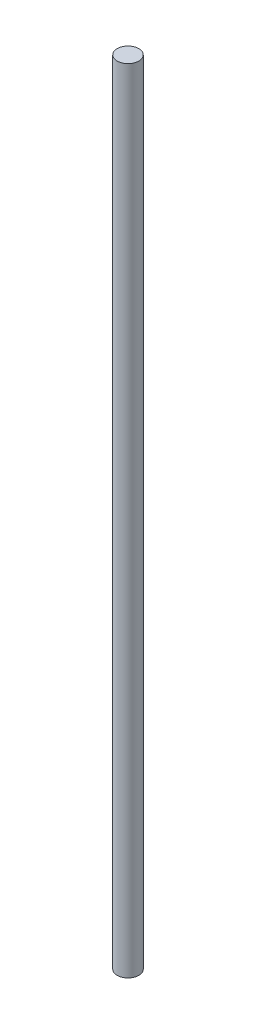
ISO-10303-21;
HEADER;
FILE_DESCRIPTION(('STEP AP214'),'2;1');
FILE_NAME('part.step','',(''),(''),'','','');
FILE_SCHEMA(('AUTOMOTIVE_DESIGN { 1 0 10303 214 1 1 1 1 }'));
ENDSEC;
DATA;
#1=APPLICATION_CONTEXT('core data for automotive mechanical design processes');
#2=APPLICATION_PROTOCOL_DEFINITION('international standard','automotive_design',2000,#1);
#3=PRODUCT_CONTEXT('',#1,'mechanical');
#4=PRODUCT('Part','Part','',(#3));
#5=PRODUCT_RELATED_PRODUCT_CATEGORY('part','',(#4));
#6=PRODUCT_DEFINITION_FORMATION('','',#4);
#7=PRODUCT_DEFINITION_CONTEXT('part definition',#1,'design');
#8=PRODUCT_DEFINITION('design','',#6,#7);
#9=PRODUCT_DEFINITION_SHAPE('','',#8);
#10=(LENGTH_UNIT() NAMED_UNIT(*) SI_UNIT(.MILLI.,.METRE.));
#11=(NAMED_UNIT(*) PLANE_ANGLE_UNIT() SI_UNIT($,.RADIAN.));
#12=(NAMED_UNIT(*) SI_UNIT($,.STERADIAN.) SOLID_ANGLE_UNIT());
#13=UNCERTAINTY_MEASURE_WITH_UNIT(LENGTH_MEASURE(1.E-05),#10,'distance_accuracy_value','');
#14=(GEOMETRIC_REPRESENTATION_CONTEXT(3) GLOBAL_UNCERTAINTY_ASSIGNED_CONTEXT((#13)) GLOBAL_UNIT_ASSIGNED_CONTEXT((#10,
#11,#12)) REPRESENTATION_CONTEXT('',''));
#15=CARTESIAN_POINT('',(0.,0.,0.));
#16=DIRECTION('',(0.,0.,1.));
#17=DIRECTION('',(1.,0.,0.));
#18=AXIS2_PLACEMENT_3D('',#15,#16,#17);
#19=CARTESIAN_POINT('',(0.,110.,0.));
#20=DIRECTION('',(0.,-1.,0.));
#21=DIRECTION('',(0.,0.,-1.));
#22=AXIS2_PLACEMENT_3D('',#19,#20,#21);
#23=CYLINDRICAL_SURFACE('',#22,1.5);
#24=CARTESIAN_POINT('',(0.,110.,0.));
#25=DIRECTION('',(0.,1.,0.));
#26=DIRECTION('',(0.,0.,1.));
#27=AXIS2_PLACEMENT_3D('',#24,#25,#26);
#28=CIRCLE('',#27,1.5);
#29=CARTESIAN_POINT('',(0.,110.,1.5));
#30=VERTEX_POINT('',#29);
#31=EDGE_CURVE('E10',#30,#30,#28,.T.);
#32=ORIENTED_EDGE('',*,*,#31,.F.);
#33=EDGE_LOOP('',(#32));
#34=FACE_BOUND('',#33,.T.);
#35=CARTESIAN_POINT('',(0.,0.,0.));
#36=DIRECTION('',(0.,1.,0.));
#37=DIRECTION('',(0.,0.,1.));
#38=AXIS2_PLACEMENT_3D('',#35,#36,#37);
#39=CIRCLE('',#38,1.5);
#40=CARTESIAN_POINT('',(0.,0.,1.5));
#41=VERTEX_POINT('',#40);
#42=EDGE_CURVE('E43',#41,#41,#39,.T.);
#43=ORIENTED_EDGE('',*,*,#42,.T.);
#44=EDGE_LOOP('',(#43));
#45=FACE_BOUND('',#44,.T.);
#46=ADVANCED_FACE('F40',(#34,#45),#23,.T.);
#47=CARTESIAN_POINT('',(0.,110.,0.));
#48=DIRECTION('',(0.,1.,0.));
#49=DIRECTION('',(0.,0.,1.));
#50=AXIS2_PLACEMENT_3D('',#47,#48,#49);
#51=PLANE('',#50);
#52=ORIENTED_EDGE('',*,*,#31,.T.);
#53=EDGE_LOOP('',(#52));
#54=FACE_BOUND('',#53,.T.);
#55=ADVANCED_FACE('F55',(#54),#51,.T.);
#56=CARTESIAN_POINT('',(0.,0.,0.));
#57=DIRECTION('',(0.,1.,0.));
#58=DIRECTION('',(0.,0.,1.));
#59=AXIS2_PLACEMENT_3D('',#56,#57,#58);
#60=PLANE('',#59);
#61=ORIENTED_EDGE('',*,*,#42,.F.);
#62=EDGE_LOOP('',(#61));
#63=FACE_BOUND('',#62,.T.);
#64=ADVANCED_FACE('F53',(#63),#60,.F.);
#65=CLOSED_SHELL('',(#46,#55,#64));
#66=MANIFOLD_SOLID_BREP('B2',#65);
#67=ADVANCED_BREP_SHAPE_REPRESENTATION('',(#18,#66),#14);
#68=SHAPE_DEFINITION_REPRESENTATION(#9,#67);
ENDSEC;
END-ISO-10303-21;
